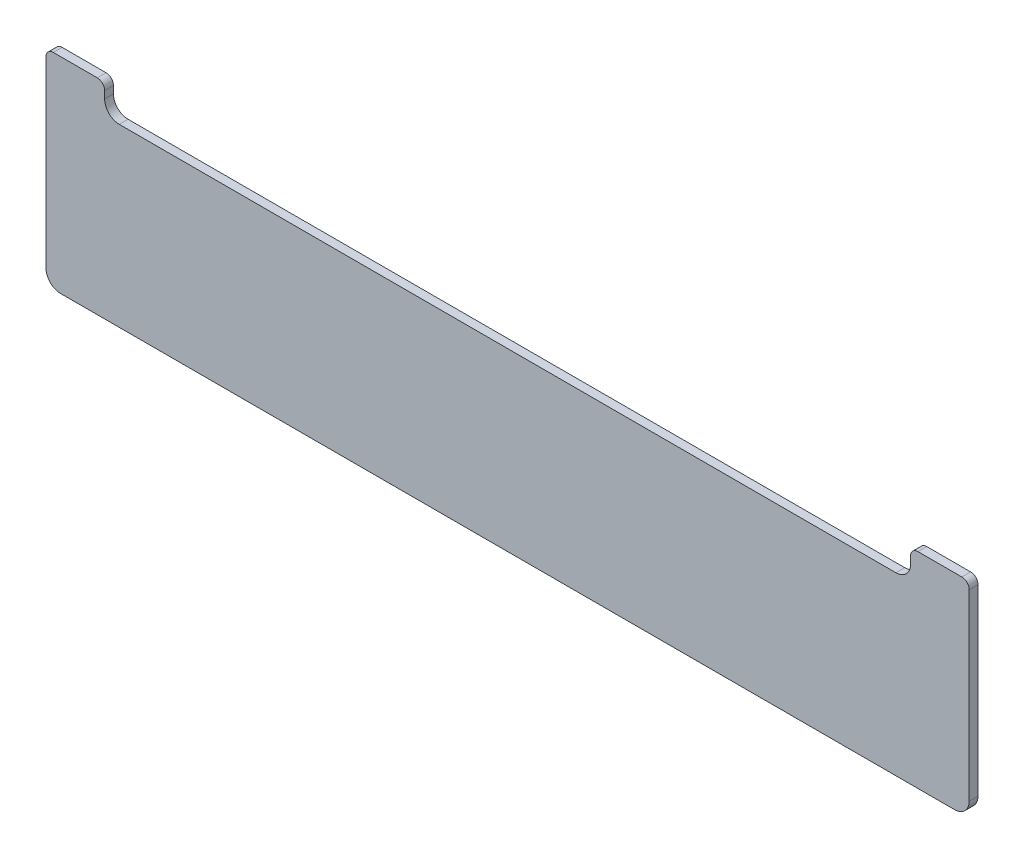
ISO-10303-21;
HEADER;
FILE_DESCRIPTION(('STEP AP214'),'2;1');
FILE_NAME('part.step','',(''),(''),'','','');
FILE_SCHEMA(('AUTOMOTIVE_DESIGN { 1 0 10303 214 1 1 1 1 }'));
ENDSEC;
DATA;
#1=APPLICATION_CONTEXT('core data for automotive mechanical design processes');
#2=APPLICATION_PROTOCOL_DEFINITION('international standard','automotive_design',2000,#1);
#3=PRODUCT_CONTEXT('',#1,'mechanical');
#4=PRODUCT('Part','Part','',(#3));
#5=PRODUCT_RELATED_PRODUCT_CATEGORY('part','',(#4));
#6=PRODUCT_DEFINITION_FORMATION('','',#4);
#7=PRODUCT_DEFINITION_CONTEXT('part definition',#1,'design');
#8=PRODUCT_DEFINITION('design','',#6,#7);
#9=PRODUCT_DEFINITION_SHAPE('','',#8);
#10=(LENGTH_UNIT() NAMED_UNIT(*) SI_UNIT(.MILLI.,.METRE.));
#11=(NAMED_UNIT(*) PLANE_ANGLE_UNIT() SI_UNIT($,.RADIAN.));
#12=(NAMED_UNIT(*) SI_UNIT($,.STERADIAN.) SOLID_ANGLE_UNIT());
#13=UNCERTAINTY_MEASURE_WITH_UNIT(LENGTH_MEASURE(1.E-05),#10,'distance_accuracy_value','');
#14=(GEOMETRIC_REPRESENTATION_CONTEXT(3) GLOBAL_UNCERTAINTY_ASSIGNED_CONTEXT((#13)) GLOBAL_UNIT_ASSIGNED_CONTEXT((#10,
#11,#12)) REPRESENTATION_CONTEXT('',''));
#15=CARTESIAN_POINT('',(0.,0.,0.));
#16=DIRECTION('',(0.,0.,1.));
#17=DIRECTION('',(1.,0.,0.));
#18=AXIS2_PLACEMENT_3D('',#15,#16,#17);
#19=CARTESIAN_POINT('',(-157.5,35.,3.));
#20=DIRECTION('',(0.,-1.,0.));
#21=DIRECTION('',(0.,0.,-1.));
#22=AXIS2_PLACEMENT_3D('',#19,#20,#21);
#23=PLANE('',#22);
#24=DIRECTION('',(-1.,0.,0.));
#25=VECTOR('',#24,1.);
#26=CARTESIAN_POINT('',(-157.5,35.,0.));
#27=LINE('',#26,#25);
#28=CARTESIAN_POINT('',(-140.,35.,0.));
#29=VERTEX_POINT('',#28);
#30=CARTESIAN_POINT('',(-155.,35.,0.));
#31=VERTEX_POINT('',#30);
#32=EDGE_CURVE('E205',#29,#31,#27,.T.);
#33=ORIENTED_EDGE('',*,*,#32,.T.);
#34=DIRECTION('',(0.,0.,-1.));
#35=VECTOR('',#34,1.);
#36=CARTESIAN_POINT('',(-155.,35.,3.));
#37=LINE('',#36,#35);
#38=CARTESIAN_POINT('',(-155.,35.,3.));
#39=VERTEX_POINT('',#38);
#40=EDGE_CURVE('E49',#31,#39,#37,.F.);
#41=ORIENTED_EDGE('',*,*,#40,.T.);
#42=DIRECTION('',(-1.,0.,0.));
#43=VECTOR('',#42,1.);
#44=CARTESIAN_POINT('',(-157.5,35.,3.));
#45=LINE('',#44,#43);
#46=CARTESIAN_POINT('',(-140.,35.,3.));
#47=VERTEX_POINT('',#46);
#48=EDGE_CURVE('E193',#47,#39,#45,.T.);
#49=ORIENTED_EDGE('',*,*,#48,.F.);
#50=DIRECTION('',(0.,0.,1.));
#51=VECTOR('',#50,1.);
#52=CARTESIAN_POINT('',(-140.,35.,3.));
#53=LINE('',#52,#51);
#54=EDGE_CURVE('E269',#47,#29,#53,.F.);
#55=ORIENTED_EDGE('',*,*,#54,.T.);
#56=EDGE_LOOP('',(#33,#41,#49,#55));
#57=FACE_BOUND('',#56,.T.);
#58=ADVANCED_FACE('F41',(#57),#23,.F.);
#59=CARTESIAN_POINT('',(157.5,-35.,3.));
#60=DIRECTION('',(-1.,0.,0.));
#61=DIRECTION('',(0.,0.,1.));
#62=AXIS2_PLACEMENT_3D('',#59,#60,#61);
#63=PLANE('',#62);
#64=DIRECTION('',(0.,1.,0.));
#65=VECTOR('',#64,1.);
#66=CARTESIAN_POINT('',(157.5,-35.,0.));
#67=LINE('',#66,#65);
#68=CARTESIAN_POINT('',(157.5,-30.,0.));
#69=VERTEX_POINT('',#68);
#70=CARTESIAN_POINT('',(157.5,32.5,0.));
#71=VERTEX_POINT('',#70);
#72=EDGE_CURVE('E202',#69,#71,#67,.T.);
#73=ORIENTED_EDGE('',*,*,#72,.T.);
#74=DIRECTION('',(0.,0.,-1.));
#75=VECTOR('',#74,1.);
#76=CARTESIAN_POINT('',(157.5,32.5,3.));
#77=LINE('',#76,#75);
#78=CARTESIAN_POINT('',(157.5,32.5,3.));
#79=VERTEX_POINT('',#78);
#80=EDGE_CURVE('E264',#71,#79,#77,.F.);
#81=ORIENTED_EDGE('',*,*,#80,.T.);
#82=DIRECTION('',(0.,1.,0.));
#83=VECTOR('',#82,1.);
#84=CARTESIAN_POINT('',(157.5,-35.,3.));
#85=LINE('',#84,#83);
#86=CARTESIAN_POINT('',(157.5,-30.,3.));
#87=VERTEX_POINT('',#86);
#88=EDGE_CURVE('E190',#87,#79,#85,.T.);
#89=ORIENTED_EDGE('',*,*,#88,.F.);
#90=DIRECTION('',(0.,0.,-1.));
#91=VECTOR('',#90,1.);
#92=CARTESIAN_POINT('',(157.5,-30.,3.));
#93=LINE('',#92,#91);
#94=EDGE_CURVE('E218',#87,#69,#93,.T.);
#95=ORIENTED_EDGE('',*,*,#94,.T.);
#96=EDGE_LOOP('',(#73,#81,#89,#95));
#97=FACE_BOUND('',#96,.T.);
#98=ADVANCED_FACE('F300',(#97),#63,.F.);
#99=CARTESIAN_POINT('',(155.,35.,0.));
#100=VERTEX_POINT('',#99);
#101=CARTESIAN_POINT('',(140.,35.,0.));
#102=VERTEX_POINT('',#101);
#103=EDGE_CURVE('E207',#100,#102,#27,.T.);
#104=ORIENTED_EDGE('',*,*,#103,.T.);
#105=DIRECTION('',(0.,0.,1.));
#106=VECTOR('',#105,1.);
#107=CARTESIAN_POINT('',(140.,35.,3.));
#108=LINE('',#107,#106);
#109=CARTESIAN_POINT('',(140.,35.,3.));
#110=VERTEX_POINT('',#109);
#111=EDGE_CURVE('E246',#102,#110,#108,.T.);
#112=ORIENTED_EDGE('',*,*,#111,.T.);
#113=CARTESIAN_POINT('',(155.,35.,3.));
#114=VERTEX_POINT('',#113);
#115=EDGE_CURVE('E197',#114,#110,#45,.T.);
#116=ORIENTED_EDGE('',*,*,#115,.F.);
#117=DIRECTION('',(0.,0.,-1.));
#118=VECTOR('',#117,1.);
#119=CARTESIAN_POINT('',(155.,35.,3.));
#120=LINE('',#119,#118);
#121=EDGE_CURVE('E243',#114,#100,#120,.T.);
#122=ORIENTED_EDGE('',*,*,#121,.T.);
#123=EDGE_LOOP('',(#104,#112,#116,#122));
#124=FACE_BOUND('',#123,.T.);
#125=ADVANCED_FACE('F309',(#124),#23,.F.);
#126=CARTESIAN_POINT('',(-157.5,-35.,3.));
#127=DIRECTION('',(1.,0.,0.));
#128=DIRECTION('',(0.,0.,-1.));
#129=AXIS2_PLACEMENT_3D('',#126,#127,#128);
#130=PLANE('',#129);
#131=DIRECTION('',(0.,-1.,0.));
#132=VECTOR('',#131,1.);
#133=CARTESIAN_POINT('',(-157.5,-35.,3.));
#134=LINE('',#133,#132);
#135=CARTESIAN_POINT('',(-157.5,32.5,3.));
#136=VERTEX_POINT('',#135);
#137=CARTESIAN_POINT('',(-157.5,-30.,3.));
#138=VERTEX_POINT('',#137);
#139=EDGE_CURVE('E198',#136,#138,#134,.T.);
#140=ORIENTED_EDGE('',*,*,#139,.F.);
#141=DIRECTION('',(0.,0.,-1.));
#142=VECTOR('',#141,1.);
#143=CARTESIAN_POINT('',(-157.5,32.5,3.));
#144=LINE('',#143,#142);
#145=CARTESIAN_POINT('',(-157.5,32.5,0.));
#146=VERTEX_POINT('',#145);
#147=EDGE_CURVE('E266',#136,#146,#144,.T.);
#148=ORIENTED_EDGE('',*,*,#147,.T.);
#149=DIRECTION('',(0.,-1.,0.));
#150=VECTOR('',#149,1.);
#151=CARTESIAN_POINT('',(-157.5,-35.,0.));
#152=LINE('',#151,#150);
#153=CARTESIAN_POINT('',(-157.5,-30.,0.));
#154=VERTEX_POINT('',#153);
#155=EDGE_CURVE('E208',#146,#154,#152,.T.);
#156=ORIENTED_EDGE('',*,*,#155,.T.);
#157=DIRECTION('',(0.,0.,-1.));
#158=VECTOR('',#157,1.);
#159=CARTESIAN_POINT('',(-157.5,-30.,3.));
#160=LINE('',#159,#158);
#161=EDGE_CURVE('E165',#154,#138,#160,.F.);
#162=ORIENTED_EDGE('',*,*,#161,.T.);
#163=EDGE_LOOP('',(#140,#148,#156,#162));
#164=FACE_BOUND('',#163,.T.);
#165=ADVANCED_FACE('F281',(#164),#130,.F.);
#166=CARTESIAN_POINT('',(-157.5,-35.,3.));
#167=DIRECTION('',(0.,1.,0.));
#168=DIRECTION('',(0.,0.,1.));
#169=AXIS2_PLACEMENT_3D('',#166,#167,#168);
#170=PLANE('',#169);
#171=DIRECTION('',(1.,0.,0.));
#172=VECTOR('',#171,1.);
#173=CARTESIAN_POINT('',(-157.5,-35.,0.));
#174=LINE('',#173,#172);
#175=CARTESIAN_POINT('',(-152.5,-35.,0.));
#176=VERTEX_POINT('',#175);
#177=CARTESIAN_POINT('',(152.5,-35.,0.));
#178=VERTEX_POINT('',#177);
#179=EDGE_CURVE('E194',#176,#178,#174,.T.);
#180=ORIENTED_EDGE('',*,*,#179,.T.);
#181=DIRECTION('',(0.,0.,-1.));
#182=VECTOR('',#181,1.);
#183=CARTESIAN_POINT('',(152.5,-35.,3.));
#184=LINE('',#183,#182);
#185=CARTESIAN_POINT('',(152.5,-35.,3.));
#186=VERTEX_POINT('',#185);
#187=EDGE_CURVE('E229',#178,#186,#184,.F.);
#188=ORIENTED_EDGE('',*,*,#187,.T.);
#189=DIRECTION('',(1.,0.,0.));
#190=VECTOR('',#189,1.);
#191=CARTESIAN_POINT('',(-157.5,-35.,3.));
#192=LINE('',#191,#190);
#193=CARTESIAN_POINT('',(-152.5,-35.,3.));
#194=VERTEX_POINT('',#193);
#195=EDGE_CURVE('E176',#194,#186,#192,.T.);
#196=ORIENTED_EDGE('',*,*,#195,.F.);
#197=DIRECTION('',(0.,0.,-1.));
#198=VECTOR('',#197,1.);
#199=CARTESIAN_POINT('',(-152.5,-35.,3.));
#200=LINE('',#199,#198);
#201=EDGE_CURVE('E226',#194,#176,#200,.T.);
#202=ORIENTED_EDGE('',*,*,#201,.T.);
#203=EDGE_LOOP('',(#180,#188,#196,#202));
#204=FACE_BOUND('',#203,.T.);
#205=ADVANCED_FACE('F292',(#204),#170,.F.);
#206=CARTESIAN_POINT('',(0.,0.,3.));
#207=DIRECTION('',(0.,0.,-1.));
#208=DIRECTION('',(-1.,0.,0.));
#209=AXIS2_PLACEMENT_3D('',#206,#207,#208);
#210=PLANE('',#209);
#211=ORIENTED_EDGE('',*,*,#115,.T.);
#212=CARTESIAN_POINT('',(140.,32.5,3.));
#213=DIRECTION('',(0.,0.,-1.));
#214=DIRECTION('',(-1.,0.,0.));
#215=AXIS2_PLACEMENT_3D('',#212,#213,#214);
#216=CIRCLE('',#215,2.5);
#217=CARTESIAN_POINT('',(137.5,32.5,3.));
#218=VERTEX_POINT('',#217);
#219=EDGE_CURVE('E180',#110,#218,#216,.F.);
#220=ORIENTED_EDGE('',*,*,#219,.T.);
#221=DIRECTION('',(0.,1.,0.));
#222=VECTOR('',#221,1.);
#223=CARTESIAN_POINT('',(137.5,35.,3.));
#224=LINE('',#223,#222);
#225=CARTESIAN_POINT('',(137.5,30.,3.));
#226=VERTEX_POINT('',#225);
#227=EDGE_CURVE('E171',#226,#218,#224,.T.);
#228=ORIENTED_EDGE('',*,*,#227,.F.);
#229=CARTESIAN_POINT('',(132.5,30.,3.));
#230=DIRECTION('',(0.,0.,-1.));
#231=DIRECTION('',(-1.,0.,0.));
#232=AXIS2_PLACEMENT_3D('',#229,#230,#231);
#233=CIRCLE('',#232,5.);
#234=CARTESIAN_POINT('',(132.5,25.,3.));
#235=VERTEX_POINT('',#234);
#236=EDGE_CURVE('E154',#226,#235,#233,.T.);
#237=ORIENTED_EDGE('',*,*,#236,.T.);
#238=DIRECTION('',(1.,0.,0.));
#239=VECTOR('',#238,1.);
#240=CARTESIAN_POINT('',(-137.5,25.,3.));
#241=LINE('',#240,#239);
#242=CARTESIAN_POINT('',(-132.5,25.,3.));
#243=VERTEX_POINT('',#242);
#244=EDGE_CURVE('E182',#243,#235,#241,.T.);
#245=ORIENTED_EDGE('',*,*,#244,.F.);
#246=CARTESIAN_POINT('',(-132.5,30.,3.));
#247=DIRECTION('',(0.,0.,-1.));
#248=DIRECTION('',(-1.,0.,0.));
#249=AXIS2_PLACEMENT_3D('',#246,#247,#248);
#250=CIRCLE('',#249,5.);
#251=CARTESIAN_POINT('',(-137.5,30.,3.));
#252=VERTEX_POINT('',#251);
#253=EDGE_CURVE('E238',#243,#252,#250,.T.);
#254=ORIENTED_EDGE('',*,*,#253,.T.);
#255=DIRECTION('',(0.,-1.,0.));
#256=VECTOR('',#255,1.);
#257=CARTESIAN_POINT('',(-137.5,35.,3.));
#258=LINE('',#257,#256);
#259=CARTESIAN_POINT('',(-137.5,32.5,3.));
#260=VERTEX_POINT('',#259);
#261=EDGE_CURVE('E186',#260,#252,#258,.T.);
#262=ORIENTED_EDGE('',*,*,#261,.F.);
#263=CARTESIAN_POINT('',(-140.,32.5,3.));
#264=DIRECTION('',(0.,0.,-1.));
#265=DIRECTION('',(-1.,0.,0.));
#266=AXIS2_PLACEMENT_3D('',#263,#264,#265);
#267=CIRCLE('',#266,2.5);
#268=EDGE_CURVE('E249',#260,#47,#267,.F.);
#269=ORIENTED_EDGE('',*,*,#268,.T.);
#270=ORIENTED_EDGE('',*,*,#48,.T.);
#271=CARTESIAN_POINT('',(-155.,32.5,3.));
#272=DIRECTION('',(0.,0.,-1.));
#273=DIRECTION('',(-1.,0.,0.));
#274=AXIS2_PLACEMENT_3D('',#271,#272,#273);
#275=CIRCLE('',#274,2.5);
#276=EDGE_CURVE('E251',#39,#136,#275,.F.);
#277=ORIENTED_EDGE('',*,*,#276,.T.);
#278=ORIENTED_EDGE('',*,*,#139,.T.);
#279=CARTESIAN_POINT('',(-152.5,-30.,3.));
#280=DIRECTION('',(0.,0.,-1.));
#281=DIRECTION('',(-1.,0.,0.));
#282=AXIS2_PLACEMENT_3D('',#279,#280,#281);
#283=CIRCLE('',#282,5.);
#284=EDGE_CURVE('E231',#138,#194,#283,.F.);
#285=ORIENTED_EDGE('',*,*,#284,.T.);
#286=ORIENTED_EDGE('',*,*,#195,.T.);
#287=CARTESIAN_POINT('',(152.5,-30.,3.));
#288=DIRECTION('',(0.,0.,-1.));
#289=DIRECTION('',(-1.,0.,0.));
#290=AXIS2_PLACEMENT_3D('',#287,#288,#289);
#291=CIRCLE('',#290,5.);
#292=EDGE_CURVE('E233',#186,#87,#291,.F.);
#293=ORIENTED_EDGE('',*,*,#292,.T.);
#294=ORIENTED_EDGE('',*,*,#88,.T.);
#295=CARTESIAN_POINT('',(155.,32.5,3.));
#296=DIRECTION('',(0.,0.,-1.));
#297=DIRECTION('',(-1.,0.,0.));
#298=AXIS2_PLACEMENT_3D('',#295,#296,#297);
#299=CIRCLE('',#298,2.5);
#300=EDGE_CURVE('E253',#79,#114,#299,.F.);
#301=ORIENTED_EDGE('',*,*,#300,.T.);
#302=EDGE_LOOP('',(#211,#220,#228,#237,#245,#254,#262,#269,#270,#277,#278,#285,#286,#293,#294,#301));
#303=FACE_BOUND('',#302,.T.);
#304=ADVANCED_FACE('F179',(#303),#210,.F.);
#305=CARTESIAN_POINT('',(0.,0.,0.));
#306=DIRECTION('',(0.,0.,-1.));
#307=DIRECTION('',(-1.,0.,0.));
#308=AXIS2_PLACEMENT_3D('',#305,#306,#307);
#309=PLANE('',#308);
#310=DIRECTION('',(0.,1.,0.));
#311=VECTOR('',#310,1.);
#312=CARTESIAN_POINT('',(137.5,35.,0.));
#313=LINE('',#312,#311);
#314=CARTESIAN_POINT('',(137.5,30.,0.));
#315=VERTEX_POINT('',#314);
#316=CARTESIAN_POINT('',(137.5,32.5,0.));
#317=VERTEX_POINT('',#316);
#318=EDGE_CURVE('E174',#315,#317,#313,.T.);
#319=ORIENTED_EDGE('',*,*,#318,.T.);
#320=CARTESIAN_POINT('',(140.,32.5,0.));
#321=DIRECTION('',(0.,0.,-1.));
#322=DIRECTION('',(-1.,0.,0.));
#323=AXIS2_PLACEMENT_3D('',#320,#321,#322);
#324=CIRCLE('',#323,2.5);
#325=EDGE_CURVE('E262',#317,#102,#324,.T.);
#326=ORIENTED_EDGE('',*,*,#325,.T.);
#327=ORIENTED_EDGE('',*,*,#103,.F.);
#328=CARTESIAN_POINT('',(155.,32.5,0.));
#329=DIRECTION('',(0.,0.,-1.));
#330=DIRECTION('',(-1.,0.,0.));
#331=AXIS2_PLACEMENT_3D('',#328,#329,#330);
#332=CIRCLE('',#331,2.5);
#333=EDGE_CURVE('E260',#100,#71,#332,.T.);
#334=ORIENTED_EDGE('',*,*,#333,.T.);
#335=ORIENTED_EDGE('',*,*,#72,.F.);
#336=CARTESIAN_POINT('',(152.5,-30.,0.));
#337=DIRECTION('',(0.,0.,-1.));
#338=DIRECTION('',(-1.,0.,0.));
#339=AXIS2_PLACEMENT_3D('',#336,#337,#338);
#340=CIRCLE('',#339,5.);
#341=EDGE_CURVE('E224',#69,#178,#340,.T.);
#342=ORIENTED_EDGE('',*,*,#341,.T.);
#343=ORIENTED_EDGE('',*,*,#179,.F.);
#344=CARTESIAN_POINT('',(-152.5,-30.,0.));
#345=DIRECTION('',(0.,0.,-1.));
#346=DIRECTION('',(-1.,0.,0.));
#347=AXIS2_PLACEMENT_3D('',#344,#345,#346);
#348=CIRCLE('',#347,5.);
#349=EDGE_CURVE('E221',#176,#154,#348,.T.);
#350=ORIENTED_EDGE('',*,*,#349,.T.);
#351=ORIENTED_EDGE('',*,*,#155,.F.);
#352=CARTESIAN_POINT('',(-155.,32.5,0.));
#353=DIRECTION('',(0.,0.,-1.));
#354=DIRECTION('',(-1.,0.,0.));
#355=AXIS2_PLACEMENT_3D('',#352,#353,#354);
#356=CIRCLE('',#355,2.5);
#357=EDGE_CURVE('E62',#146,#31,#356,.T.);
#358=ORIENTED_EDGE('',*,*,#357,.T.);
#359=ORIENTED_EDGE('',*,*,#32,.F.);
#360=CARTESIAN_POINT('',(-140.,32.5,0.));
#361=DIRECTION('',(0.,0.,-1.));
#362=DIRECTION('',(-1.,0.,0.));
#363=AXIS2_PLACEMENT_3D('',#360,#361,#362);
#364=CIRCLE('',#363,2.5);
#365=CARTESIAN_POINT('',(-137.5,32.5,0.));
#366=VERTEX_POINT('',#365);
#367=EDGE_CURVE('E56',#29,#366,#364,.T.);
#368=ORIENTED_EDGE('',*,*,#367,.T.);
#369=DIRECTION('',(0.,-1.,0.));
#370=VECTOR('',#369,1.);
#371=CARTESIAN_POINT('',(-137.5,35.,0.));
#372=LINE('',#371,#370);
#373=CARTESIAN_POINT('',(-137.5,30.,0.));
#374=VERTEX_POINT('',#373);
#375=EDGE_CURVE('E181',#366,#374,#372,.T.);
#376=ORIENTED_EDGE('',*,*,#375,.T.);
#377=CARTESIAN_POINT('',(-132.5,30.,0.));
#378=DIRECTION('',(0.,0.,-1.));
#379=DIRECTION('',(-1.,0.,0.));
#380=AXIS2_PLACEMENT_3D('',#377,#378,#379);
#381=CIRCLE('',#380,5.);
#382=CARTESIAN_POINT('',(-132.5,25.,0.));
#383=VERTEX_POINT('',#382);
#384=EDGE_CURVE('E241',#374,#383,#381,.F.);
#385=ORIENTED_EDGE('',*,*,#384,.T.);
#386=DIRECTION('',(1.,0.,0.));
#387=VECTOR('',#386,1.);
#388=CARTESIAN_POINT('',(-137.5,25.,0.));
#389=LINE('',#388,#387);
#390=CARTESIAN_POINT('',(132.5,25.,0.));
#391=VERTEX_POINT('',#390);
#392=EDGE_CURVE('E184',#383,#391,#389,.T.);
#393=ORIENTED_EDGE('',*,*,#392,.T.);
#394=CARTESIAN_POINT('',(132.5,30.,0.));
#395=DIRECTION('',(0.,0.,-1.));
#396=DIRECTION('',(-1.,0.,0.));
#397=AXIS2_PLACEMENT_3D('',#394,#395,#396);
#398=CIRCLE('',#397,5.);
#399=EDGE_CURVE('E164',#391,#315,#398,.F.);
#400=ORIENTED_EDGE('',*,*,#399,.T.);
#401=EDGE_LOOP('',(#319,#326,#327,#334,#335,#342,#343,#350,#351,#358,#359,#368,#376,#385,#393,#400));
#402=FACE_BOUND('',#401,.T.);
#403=ADVANCED_FACE('F282',(#402),#309,.T.);
#404=CARTESIAN_POINT('',(-137.5,35.,0.));
#405=DIRECTION('',(-1.,0.,0.));
#406=DIRECTION('',(0.,0.,1.));
#407=AXIS2_PLACEMENT_3D('',#404,#405,#406);
#408=PLANE('',#407);
#409=ORIENTED_EDGE('',*,*,#375,.F.);
#410=DIRECTION('',(0.,0.,1.));
#411=VECTOR('',#410,1.);
#412=CARTESIAN_POINT('',(-137.5,32.5,0.));
#413=LINE('',#412,#411);
#414=EDGE_CURVE('E11',#366,#260,#413,.T.);
#415=ORIENTED_EDGE('',*,*,#414,.T.);
#416=ORIENTED_EDGE('',*,*,#261,.T.);
#417=DIRECTION('',(0.,0.,1.));
#418=VECTOR('',#417,1.);
#419=CARTESIAN_POINT('',(-137.5,30.,0.));
#420=LINE('',#419,#418);
#421=EDGE_CURVE('E215',#252,#374,#420,.F.);
#422=ORIENTED_EDGE('',*,*,#421,.T.);
#423=EDGE_LOOP('',(#409,#415,#416,#422));
#424=FACE_BOUND('',#423,.T.);
#425=ADVANCED_FACE('F319',(#424),#408,.F.);
#426=CARTESIAN_POINT('',(137.5,35.,0.));
#427=DIRECTION('',(1.,0.,0.));
#428=DIRECTION('',(0.,0.,-1.));
#429=AXIS2_PLACEMENT_3D('',#426,#427,#428);
#430=PLANE('',#429);
#431=ORIENTED_EDGE('',*,*,#227,.T.);
#432=DIRECTION('',(0.,0.,1.));
#433=VECTOR('',#432,1.);
#434=CARTESIAN_POINT('',(137.5,32.5,0.));
#435=LINE('',#434,#433);
#436=EDGE_CURVE('E256',#218,#317,#435,.F.);
#437=ORIENTED_EDGE('',*,*,#436,.T.);
#438=ORIENTED_EDGE('',*,*,#318,.F.);
#439=DIRECTION('',(0.,0.,1.));
#440=VECTOR('',#439,1.);
#441=CARTESIAN_POINT('',(137.5,30.,3.));
#442=LINE('',#441,#440);
#443=EDGE_CURVE('E158',#315,#226,#442,.T.);
#444=ORIENTED_EDGE('',*,*,#443,.T.);
#445=EDGE_LOOP('',(#431,#437,#438,#444));
#446=FACE_BOUND('',#445,.T.);
#447=ADVANCED_FACE('F170',(#446),#430,.F.);
#448=CARTESIAN_POINT('',(-137.5,25.,0.));
#449=DIRECTION('',(0.,-1.,0.));
#450=DIRECTION('',(0.,0.,-1.));
#451=AXIS2_PLACEMENT_3D('',#448,#449,#450);
#452=PLANE('',#451);
#453=ORIENTED_EDGE('',*,*,#244,.T.);
#454=DIRECTION('',(0.,0.,1.));
#455=VECTOR('',#454,1.);
#456=CARTESIAN_POINT('',(132.5,25.,0.));
#457=LINE('',#456,#455);
#458=EDGE_CURVE('E159',#235,#391,#457,.F.);
#459=ORIENTED_EDGE('',*,*,#458,.T.);
#460=ORIENTED_EDGE('',*,*,#392,.F.);
#461=DIRECTION('',(0.,0.,1.));
#462=VECTOR('',#461,1.);
#463=CARTESIAN_POINT('',(-132.5,25.,3.));
#464=LINE('',#463,#462);
#465=EDGE_CURVE('E175',#383,#243,#464,.T.);
#466=ORIENTED_EDGE('',*,*,#465,.T.);
#467=EDGE_LOOP('',(#453,#459,#460,#466));
#468=FACE_BOUND('',#467,.T.);
#469=ADVANCED_FACE('F328',(#468),#452,.F.);
#470=CARTESIAN_POINT('',(132.5,30.,0.));
#471=DIRECTION('',(0.,0.,-1.));
#472=DIRECTION('',(-1.,0.,0.));
#473=AXIS2_PLACEMENT_3D('',#470,#471,#472);
#474=CYLINDRICAL_SURFACE('',#473,5.);
#475=ORIENTED_EDGE('',*,*,#399,.F.);
#476=ORIENTED_EDGE('',*,*,#458,.F.);
#477=ORIENTED_EDGE('',*,*,#236,.F.);
#478=ORIENTED_EDGE('',*,*,#443,.F.);
#479=EDGE_LOOP('',(#475,#476,#477,#478));
#480=FACE_BOUND('',#479,.T.);
#481=ADVANCED_FACE('F157',(#480),#474,.F.);
#482=CARTESIAN_POINT('',(-132.5,30.,0.));
#483=DIRECTION('',(0.,0.,-1.));
#484=DIRECTION('',(-1.,0.,0.));
#485=AXIS2_PLACEMENT_3D('',#482,#483,#484);
#486=CYLINDRICAL_SURFACE('',#485,5.);
#487=ORIENTED_EDGE('',*,*,#384,.F.);
#488=ORIENTED_EDGE('',*,*,#421,.F.);
#489=ORIENTED_EDGE('',*,*,#253,.F.);
#490=ORIENTED_EDGE('',*,*,#465,.F.);
#491=EDGE_LOOP('',(#487,#488,#489,#490));
#492=FACE_BOUND('',#491,.T.);
#493=ADVANCED_FACE('F325',(#492),#486,.F.);
#494=CARTESIAN_POINT('',(152.5,-30.,3.));
#495=DIRECTION('',(0.,0.,-1.));
#496=DIRECTION('',(-1.,0.,0.));
#497=AXIS2_PLACEMENT_3D('',#494,#495,#496);
#498=CYLINDRICAL_SURFACE('',#497,5.);
#499=ORIENTED_EDGE('',*,*,#292,.F.);
#500=ORIENTED_EDGE('',*,*,#187,.F.);
#501=ORIENTED_EDGE('',*,*,#341,.F.);
#502=ORIENTED_EDGE('',*,*,#94,.F.);
#503=EDGE_LOOP('',(#499,#500,#501,#502));
#504=FACE_BOUND('',#503,.T.);
#505=ADVANCED_FACE('F295',(#504),#498,.T.);
#506=CARTESIAN_POINT('',(-152.5,-30.,3.));
#507=DIRECTION('',(0.,0.,-1.));
#508=DIRECTION('',(-1.,0.,0.));
#509=AXIS2_PLACEMENT_3D('',#506,#507,#508);
#510=CYLINDRICAL_SURFACE('',#509,5.);
#511=ORIENTED_EDGE('',*,*,#284,.F.);
#512=ORIENTED_EDGE('',*,*,#161,.F.);
#513=ORIENTED_EDGE('',*,*,#349,.F.);
#514=ORIENTED_EDGE('',*,*,#201,.F.);
#515=EDGE_LOOP('',(#511,#512,#513,#514));
#516=FACE_BOUND('',#515,.T.);
#517=ADVANCED_FACE('F288',(#516),#510,.T.);
#518=CARTESIAN_POINT('',(140.,32.5,3.));
#519=DIRECTION('',(0.,0.,1.));
#520=DIRECTION('',(1.,0.,0.));
#521=AXIS2_PLACEMENT_3D('',#518,#519,#520);
#522=CYLINDRICAL_SURFACE('',#521,2.5);
#523=ORIENTED_EDGE('',*,*,#325,.F.);
#524=ORIENTED_EDGE('',*,*,#436,.F.);
#525=ORIENTED_EDGE('',*,*,#219,.F.);
#526=ORIENTED_EDGE('',*,*,#111,.F.);
#527=EDGE_LOOP('',(#523,#524,#525,#526));
#528=FACE_BOUND('',#527,.T.);
#529=ADVANCED_FACE('F314',(#528),#522,.T.);
#530=CARTESIAN_POINT('',(155.,32.5,3.));
#531=DIRECTION('',(0.,0.,-1.));
#532=DIRECTION('',(-1.,0.,0.));
#533=AXIS2_PLACEMENT_3D('',#530,#531,#532);
#534=CYLINDRICAL_SURFACE('',#533,2.5);
#535=ORIENTED_EDGE('',*,*,#300,.F.);
#536=ORIENTED_EDGE('',*,*,#80,.F.);
#537=ORIENTED_EDGE('',*,*,#333,.F.);
#538=ORIENTED_EDGE('',*,*,#121,.F.);
#539=EDGE_LOOP('',(#535,#536,#537,#538));
#540=FACE_BOUND('',#539,.T.);
#541=ADVANCED_FACE('F304',(#540),#534,.T.);
#542=CARTESIAN_POINT('',(-155.,32.5,3.));
#543=DIRECTION('',(0.,0.,-1.));
#544=DIRECTION('',(-1.,0.,0.));
#545=AXIS2_PLACEMENT_3D('',#542,#543,#544);
#546=CYLINDRICAL_SURFACE('',#545,2.5);
#547=ORIENTED_EDGE('',*,*,#276,.F.);
#548=ORIENTED_EDGE('',*,*,#40,.F.);
#549=ORIENTED_EDGE('',*,*,#357,.F.);
#550=ORIENTED_EDGE('',*,*,#147,.F.);
#551=EDGE_LOOP('',(#547,#548,#549,#550));
#552=FACE_BOUND('',#551,.T.);
#553=ADVANCED_FACE('F279',(#552),#546,.T.);
#554=CARTESIAN_POINT('',(-140.,32.5,0.));
#555=DIRECTION('',(0.,0.,1.));
#556=DIRECTION('',(1.,0.,0.));
#557=AXIS2_PLACEMENT_3D('',#554,#555,#556);
#558=CYLINDRICAL_SURFACE('',#557,2.5);
#559=ORIENTED_EDGE('',*,*,#367,.F.);
#560=ORIENTED_EDGE('',*,*,#54,.F.);
#561=ORIENTED_EDGE('',*,*,#268,.F.);
#562=ORIENTED_EDGE('',*,*,#414,.F.);
#563=EDGE_LOOP('',(#559,#560,#561,#562));
#564=FACE_BOUND('',#563,.T.);
#565=ADVANCED_FACE('F43',(#564),#558,.T.);
#566=CLOSED_SHELL('',(#58,#98,#125,#165,#205,#304,#403,#425,#447,#469,#481,#493,#505,#517,#529,
#541,#553,#565));
#567=MANIFOLD_SOLID_BREP('B2',#566);
#568=ADVANCED_BREP_SHAPE_REPRESENTATION('',(#18,#567),#14);
#569=SHAPE_DEFINITION_REPRESENTATION(#9,#568);
ENDSEC;
END-ISO-10303-21;
